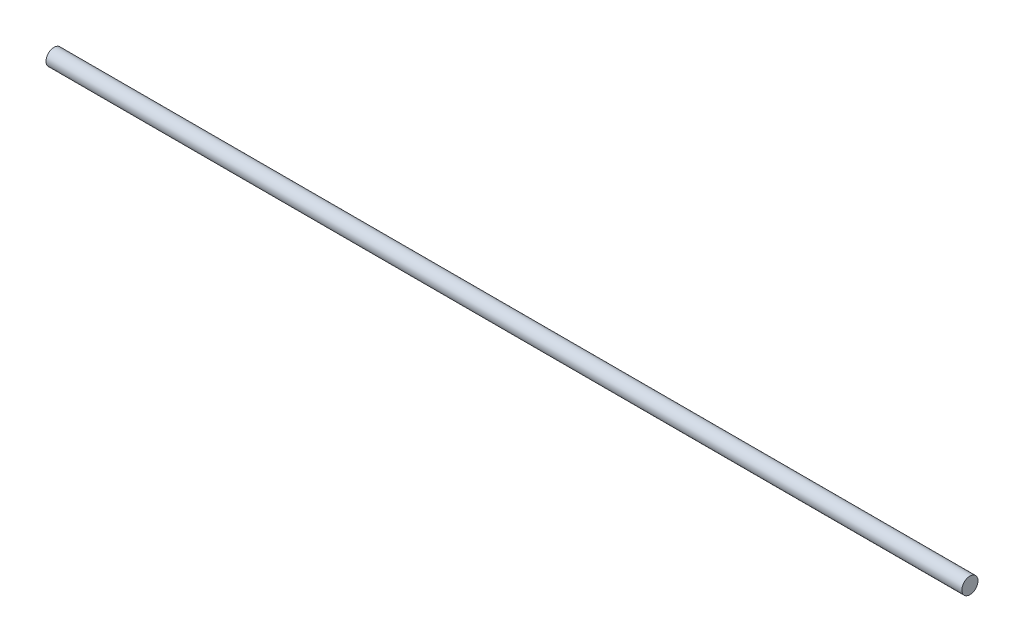
ISO-10303-21;
HEADER;
FILE_DESCRIPTION(('STEP AP214'),'2;1');
FILE_NAME('part.step','',(''),(''),'','','');
FILE_SCHEMA(('AUTOMOTIVE_DESIGN { 1 0 10303 214 1 1 1 1 }'));
ENDSEC;
DATA;
#1=APPLICATION_CONTEXT('core data for automotive mechanical design processes');
#2=APPLICATION_PROTOCOL_DEFINITION('international standard','automotive_design',2000,#1);
#3=PRODUCT_CONTEXT('',#1,'mechanical');
#4=PRODUCT('Part','Part','',(#3));
#5=PRODUCT_RELATED_PRODUCT_CATEGORY('part','',(#4));
#6=PRODUCT_DEFINITION_FORMATION('','',#4);
#7=PRODUCT_DEFINITION_CONTEXT('part definition',#1,'design');
#8=PRODUCT_DEFINITION('design','',#6,#7);
#9=PRODUCT_DEFINITION_SHAPE('','',#8);
#10=(LENGTH_UNIT() NAMED_UNIT(*) SI_UNIT(.MILLI.,.METRE.));
#11=(NAMED_UNIT(*) PLANE_ANGLE_UNIT() SI_UNIT($,.RADIAN.));
#12=(NAMED_UNIT(*) SI_UNIT($,.STERADIAN.) SOLID_ANGLE_UNIT());
#13=UNCERTAINTY_MEASURE_WITH_UNIT(LENGTH_MEASURE(1.E-05),#10,'distance_accuracy_value','');
#14=(GEOMETRIC_REPRESENTATION_CONTEXT(3) GLOBAL_UNCERTAINTY_ASSIGNED_CONTEXT((#13)) GLOBAL_UNIT_ASSIGNED_CONTEXT((#10,
#11,#12)) REPRESENTATION_CONTEXT('',''));
#15=CARTESIAN_POINT('',(0.,0.,0.));
#16=DIRECTION('',(0.,0.,1.));
#17=DIRECTION('',(1.,0.,0.));
#18=AXIS2_PLACEMENT_3D('',#15,#16,#17);
#19=CARTESIAN_POINT('',(170.,0.,0.));
#20=DIRECTION('',(-1.,0.,0.));
#21=DIRECTION('',(0.,0.,1.));
#22=AXIS2_PLACEMENT_3D('',#19,#20,#21);
#23=CYLINDRICAL_SURFACE('',#22,3.);
#24=CARTESIAN_POINT('',(170.,0.,0.));
#25=DIRECTION('',(1.,0.,0.));
#26=DIRECTION('',(0.,0.,-1.));
#27=AXIS2_PLACEMENT_3D('',#24,#25,#26);
#28=CIRCLE('',#27,3.);
#29=CARTESIAN_POINT('',(170.,0.,-3.));
#30=VERTEX_POINT('',#29);
#31=EDGE_CURVE('E10',#30,#30,#28,.T.);
#32=ORIENTED_EDGE('',*,*,#31,.F.);
#33=EDGE_LOOP('',(#32));
#34=FACE_BOUND('',#33,.T.);
#35=CARTESIAN_POINT('',(-170.,0.,0.));
#36=DIRECTION('',(1.,0.,0.));
#37=DIRECTION('',(0.,0.,-1.));
#38=AXIS2_PLACEMENT_3D('',#35,#36,#37);
#39=CIRCLE('',#38,3.);
#40=CARTESIAN_POINT('',(-170.,0.,-3.));
#41=VERTEX_POINT('',#40);
#42=EDGE_CURVE('E44',#41,#41,#39,.T.);
#43=ORIENTED_EDGE('',*,*,#42,.T.);
#44=EDGE_LOOP('',(#43));
#45=FACE_BOUND('',#44,.T.);
#46=ADVANCED_FACE('F41',(#34,#45),#23,.T.);
#47=CARTESIAN_POINT('',(170.,0.,0.));
#48=DIRECTION('',(1.,0.,0.));
#49=DIRECTION('',(0.,0.,-1.));
#50=AXIS2_PLACEMENT_3D('',#47,#48,#49);
#51=PLANE('',#50);
#52=ORIENTED_EDGE('',*,*,#31,.T.);
#53=EDGE_LOOP('',(#52));
#54=FACE_BOUND('',#53,.T.);
#55=ADVANCED_FACE('F56',(#54),#51,.T.);
#56=CARTESIAN_POINT('',(-170.,0.,0.));
#57=DIRECTION('',(1.,0.,0.));
#58=DIRECTION('',(0.,0.,-1.));
#59=AXIS2_PLACEMENT_3D('',#56,#57,#58);
#60=PLANE('',#59);
#61=ORIENTED_EDGE('',*,*,#42,.F.);
#62=EDGE_LOOP('',(#61));
#63=FACE_BOUND('',#62,.T.);
#64=ADVANCED_FACE('F54',(#63),#60,.F.);
#65=CLOSED_SHELL('',(#46,#55,#64));
#66=MANIFOLD_SOLID_BREP('B2',#65);
#67=ADVANCED_BREP_SHAPE_REPRESENTATION('',(#18,#66),#14);
#68=SHAPE_DEFINITION_REPRESENTATION(#9,#67);
ENDSEC;
END-ISO-10303-21;
